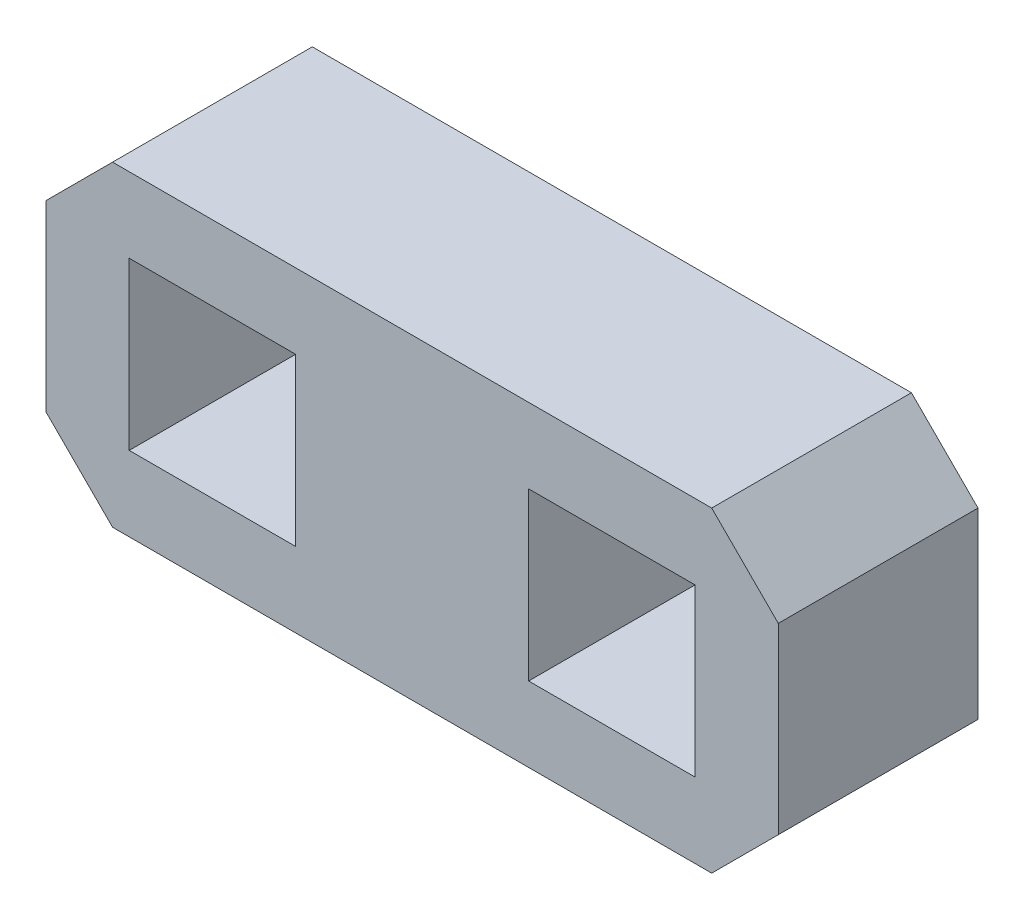
ISO-10303-21;
HEADER;
FILE_DESCRIPTION(('STEP AP214'),'2;1');
FILE_NAME('part.step','',(''),(''),'','','');
FILE_SCHEMA(('AUTOMOTIVE_DESIGN { 1 0 10303 214 1 1 1 1 }'));
ENDSEC;
DATA;
#1=APPLICATION_CONTEXT('core data for automotive mechanical design processes');
#2=APPLICATION_PROTOCOL_DEFINITION('international standard','automotive_design',2000,#1);
#3=PRODUCT_CONTEXT('',#1,'mechanical');
#4=PRODUCT('Part','Part','',(#3));
#5=PRODUCT_RELATED_PRODUCT_CATEGORY('part','',(#4));
#6=PRODUCT_DEFINITION_FORMATION('','',#4);
#7=PRODUCT_DEFINITION_CONTEXT('part definition',#1,'design');
#8=PRODUCT_DEFINITION('design','',#6,#7);
#9=PRODUCT_DEFINITION_SHAPE('','',#8);
#10=(LENGTH_UNIT() NAMED_UNIT(*) SI_UNIT(.MILLI.,.METRE.));
#11=(NAMED_UNIT(*) PLANE_ANGLE_UNIT() SI_UNIT($,.RADIAN.));
#12=(NAMED_UNIT(*) SI_UNIT($,.STERADIAN.) SOLID_ANGLE_UNIT());
#13=UNCERTAINTY_MEASURE_WITH_UNIT(LENGTH_MEASURE(1.E-05),#10,'distance_accuracy_value','');
#14=(GEOMETRIC_REPRESENTATION_CONTEXT(3) GLOBAL_UNCERTAINTY_ASSIGNED_CONTEXT((#13)) GLOBAL_UNIT_ASSIGNED_CONTEXT((#10,
#11,#12)) REPRESENTATION_CONTEXT('',''));
#15=CARTESIAN_POINT('',(0.,0.,0.));
#16=DIRECTION('',(0.,0.,1.));
#17=DIRECTION('',(1.,0.,0.));
#18=AXIS2_PLACEMENT_3D('',#15,#16,#17);
#19=CARTESIAN_POINT('',(0.,0.,3.));
#20=DIRECTION('',(0.,0.,-1.));
#21=DIRECTION('',(-1.,0.,0.));
#22=AXIS2_PLACEMENT_3D('',#19,#20,#21);
#23=PLANE('',#22);
#24=DIRECTION('',(0.,-1.,0.));
#25=VECTOR('',#24,1.);
#26=CARTESIAN_POINT('',(-11.,-4.75,3.));
#27=LINE('',#26,#25);
#28=CARTESIAN_POINT('',(-11.,2.75,3.));
#29=VERTEX_POINT('',#28);
#30=CARTESIAN_POINT('',(-11.,-2.74999999999999,3.));
#31=VERTEX_POINT('',#30);
#32=EDGE_CURVE('E269',#29,#31,#27,.T.);
#33=ORIENTED_EDGE('',*,*,#32,.T.);
#34=DIRECTION('',(-0.707106781186546,0.707106781186549,0.));
#35=VECTOR('',#34,1.);
#36=CARTESIAN_POINT('',(-8.99999999999999,-4.75,3.));
#37=LINE('',#36,#35);
#38=CARTESIAN_POINT('',(-8.99999999999999,-4.75,3.));
#39=VERTEX_POINT('',#38);
#40=EDGE_CURVE('E324',#31,#39,#37,.F.);
#41=ORIENTED_EDGE('',*,*,#40,.T.);
#42=DIRECTION('',(1.,0.,0.));
#43=VECTOR('',#42,1.);
#44=CARTESIAN_POINT('',(-11.,-4.75,3.));
#45=LINE('',#44,#43);
#46=CARTESIAN_POINT('',(8.99999999999999,-4.74999999999999,3.));
#47=VERTEX_POINT('',#46);
#48=EDGE_CURVE('E273',#39,#47,#45,.T.);
#49=ORIENTED_EDGE('',*,*,#48,.T.);
#50=DIRECTION('',(-0.70710678118655,-0.707106781186545,0.));
#51=VECTOR('',#50,1.);
#52=CARTESIAN_POINT('',(11.,-2.75,3.));
#53=LINE('',#52,#51);
#54=CARTESIAN_POINT('',(11.,-2.75,3.));
#55=VERTEX_POINT('',#54);
#56=EDGE_CURVE('E317',#47,#55,#53,.F.);
#57=ORIENTED_EDGE('',*,*,#56,.T.);
#58=DIRECTION('',(0.,1.,0.));
#59=VECTOR('',#58,1.);
#60=CARTESIAN_POINT('',(11.,-4.74999999999999,3.));
#61=LINE('',#60,#59);
#62=CARTESIAN_POINT('',(11.,2.74999999999999,3.));
#63=VERTEX_POINT('',#62);
#64=EDGE_CURVE('E263',#55,#63,#61,.T.);
#65=ORIENTED_EDGE('',*,*,#64,.T.);
#66=DIRECTION('',(0.707106781186546,-0.707106781186549,0.));
#67=VECTOR('',#66,1.);
#68=CARTESIAN_POINT('',(9.,4.75,3.));
#69=LINE('',#68,#67);
#70=CARTESIAN_POINT('',(9.,4.75,3.));
#71=VERTEX_POINT('',#70);
#72=EDGE_CURVE('E72',#63,#71,#69,.F.);
#73=ORIENTED_EDGE('',*,*,#72,.T.);
#74=DIRECTION('',(-1.,0.,0.));
#75=VECTOR('',#74,1.);
#76=CARTESIAN_POINT('',(-11.,4.75,3.));
#77=LINE('',#76,#75);
#78=CARTESIAN_POINT('',(-8.99999999999998,4.75,3.));
#79=VERTEX_POINT('',#78);
#80=EDGE_CURVE('E266',#71,#79,#77,.T.);
#81=ORIENTED_EDGE('',*,*,#80,.T.);
#82=DIRECTION('',(0.707106781186549,0.707106781186546,0.));
#83=VECTOR('',#82,1.);
#84=CARTESIAN_POINT('',(-11.,2.75,3.));
#85=LINE('',#84,#83);
#86=EDGE_CURVE('E325',#79,#29,#85,.F.);
#87=ORIENTED_EDGE('',*,*,#86,.T.);
#88=EDGE_LOOP('',(#33,#41,#49,#57,#65,#73,#81,#87));
#89=FACE_BOUND('',#88,.T.);
#90=DIRECTION('',(-1.,0.,0.));
#91=VECTOR('',#90,1.);
#92=CARTESIAN_POINT('',(3.50000000000001,2.5,3.));
#93=LINE('',#92,#91);
#94=CARTESIAN_POINT('',(8.50000000000001,2.5,3.));
#95=VERTEX_POINT('',#94);
#96=CARTESIAN_POINT('',(3.50000000000001,2.5,3.));
#97=VERTEX_POINT('',#96);
#98=EDGE_CURVE('E239',#95,#97,#93,.T.);
#99=ORIENTED_EDGE('',*,*,#98,.F.);
#100=DIRECTION('',(0.,1.,0.));
#101=VECTOR('',#100,1.);
#102=CARTESIAN_POINT('',(8.50000000000001,2.5,3.));
#103=LINE('',#102,#101);
#104=CARTESIAN_POINT('',(8.50000000000001,-2.5,3.));
#105=VERTEX_POINT('',#104);
#106=EDGE_CURVE('E213',#105,#95,#103,.T.);
#107=ORIENTED_EDGE('',*,*,#106,.F.);
#108=DIRECTION('',(1.,0.,0.));
#109=VECTOR('',#108,1.);
#110=CARTESIAN_POINT('',(3.50000000000001,-2.5,3.));
#111=LINE('',#110,#109);
#112=CARTESIAN_POINT('',(3.50000000000001,-2.5,3.));
#113=VERTEX_POINT('',#112);
#114=EDGE_CURVE('E221',#113,#105,#111,.T.);
#115=ORIENTED_EDGE('',*,*,#114,.F.);
#116=DIRECTION('',(0.,-1.,0.));
#117=VECTOR('',#116,1.);
#118=CARTESIAN_POINT('',(3.50000000000001,2.5,3.));
#119=LINE('',#118,#117);
#120=EDGE_CURVE('E245',#97,#113,#119,.T.);
#121=ORIENTED_EDGE('',*,*,#120,.F.);
#122=EDGE_LOOP('',(#99,#107,#115,#121));
#123=FACE_BOUND('',#122,.T.);
#124=DIRECTION('',(0.,1.,0.));
#125=VECTOR('',#124,1.);
#126=CARTESIAN_POINT('',(-8.50000000000001,2.5,3.));
#127=LINE('',#126,#125);
#128=CARTESIAN_POINT('',(-8.50000000000001,-2.5,3.));
#129=VERTEX_POINT('',#128);
#130=CARTESIAN_POINT('',(-8.50000000000001,2.5,3.));
#131=VERTEX_POINT('',#130);
#132=EDGE_CURVE('E184',#129,#131,#127,.T.);
#133=ORIENTED_EDGE('',*,*,#132,.T.);
#134=DIRECTION('',(1.,0.,0.));
#135=VECTOR('',#134,1.);
#136=CARTESIAN_POINT('',(-3.50000000000001,2.5,3.));
#137=LINE('',#136,#135);
#138=CARTESIAN_POINT('',(-3.50000000000001,2.5,3.));
#139=VERTEX_POINT('',#138);
#140=EDGE_CURVE('E191',#131,#139,#137,.T.);
#141=ORIENTED_EDGE('',*,*,#140,.T.);
#142=DIRECTION('',(0.,-1.,0.));
#143=VECTOR('',#142,1.);
#144=CARTESIAN_POINT('',(-3.50000000000001,2.5,3.));
#145=LINE('',#144,#143);
#146=CARTESIAN_POINT('',(-3.50000000000001,-2.5,3.));
#147=VERTEX_POINT('',#146);
#148=EDGE_CURVE('E194',#139,#147,#145,.T.);
#149=ORIENTED_EDGE('',*,*,#148,.T.);
#150=DIRECTION('',(-1.,0.,0.));
#151=VECTOR('',#150,1.);
#152=CARTESIAN_POINT('',(-3.50000000000001,-2.5,3.));
#153=LINE('',#152,#151);
#154=EDGE_CURVE('E204',#147,#129,#153,.T.);
#155=ORIENTED_EDGE('',*,*,#154,.T.);
#156=EDGE_LOOP('',(#133,#141,#149,#155));
#157=FACE_BOUND('',#156,.T.);
#158=ADVANCED_FACE('F50',(#89,#123,#157),#23,.F.);
#159=CARTESIAN_POINT('',(0.,0.,-3.));
#160=DIRECTION('',(0.,0.,-1.));
#161=DIRECTION('',(-1.,0.,0.));
#162=AXIS2_PLACEMENT_3D('',#159,#160,#161);
#163=PLANE('',#162);
#164=DIRECTION('',(0.,1.,0.));
#165=VECTOR('',#164,1.);
#166=CARTESIAN_POINT('',(8.50000000000001,2.5,-3.));
#167=LINE('',#166,#165);
#168=CARTESIAN_POINT('',(8.50000000000001,-2.5,-3.));
#169=VERTEX_POINT('',#168);
#170=CARTESIAN_POINT('',(8.50000000000001,2.5,-3.));
#171=VERTEX_POINT('',#170);
#172=EDGE_CURVE('E218',#169,#171,#167,.T.);
#173=ORIENTED_EDGE('',*,*,#172,.T.);
#174=DIRECTION('',(-1.,0.,0.));
#175=VECTOR('',#174,1.);
#176=CARTESIAN_POINT('',(3.50000000000001,2.5,-3.));
#177=LINE('',#176,#175);
#178=CARTESIAN_POINT('',(3.50000000000001,2.5,-3.));
#179=VERTEX_POINT('',#178);
#180=EDGE_CURVE('E224',#171,#179,#177,.T.);
#181=ORIENTED_EDGE('',*,*,#180,.T.);
#182=DIRECTION('',(0.,-1.,0.));
#183=VECTOR('',#182,1.);
#184=CARTESIAN_POINT('',(3.50000000000001,2.5,-3.));
#185=LINE('',#184,#183);
#186=CARTESIAN_POINT('',(3.50000000000001,-2.5,-3.));
#187=VERTEX_POINT('',#186);
#188=EDGE_CURVE('E230',#179,#187,#185,.T.);
#189=ORIENTED_EDGE('',*,*,#188,.T.);
#190=DIRECTION('',(1.,0.,0.));
#191=VECTOR('',#190,1.);
#192=CARTESIAN_POINT('',(3.50000000000001,-2.5,-3.));
#193=LINE('',#192,#191);
#194=EDGE_CURVE('E235',#187,#169,#193,.T.);
#195=ORIENTED_EDGE('',*,*,#194,.T.);
#196=EDGE_LOOP('',(#173,#181,#189,#195));
#197=FACE_BOUND('',#196,.T.);
#198=DIRECTION('',(1.,0.,0.));
#199=VECTOR('',#198,1.);
#200=CARTESIAN_POINT('',(-11.,-4.75,-3.));
#201=LINE('',#200,#199);
#202=CARTESIAN_POINT('',(-8.99999999999999,-4.75,-3.));
#203=VERTEX_POINT('',#202);
#204=CARTESIAN_POINT('',(8.99999999999999,-4.74999999999999,-3.));
#205=VERTEX_POINT('',#204);
#206=EDGE_CURVE('E270',#203,#205,#201,.T.);
#207=ORIENTED_EDGE('',*,*,#206,.F.);
#208=DIRECTION('',(0.707106781186546,-0.707106781186549,0.));
#209=VECTOR('',#208,1.);
#210=CARTESIAN_POINT('',(-6.87500000000001,-6.87499999999998,-3.));
#211=LINE('',#210,#209);
#212=CARTESIAN_POINT('',(-11.,-2.74999999999999,-3.));
#213=VERTEX_POINT('',#212);
#214=EDGE_CURVE('E307',#203,#213,#211,.F.);
#215=ORIENTED_EDGE('',*,*,#214,.T.);
#216=DIRECTION('',(0.,-1.,0.));
#217=VECTOR('',#216,1.);
#218=CARTESIAN_POINT('',(-11.,-4.75,-3.));
#219=LINE('',#218,#217);
#220=CARTESIAN_POINT('',(-11.,2.75,-3.));
#221=VERTEX_POINT('',#220);
#222=EDGE_CURVE('E282',#221,#213,#219,.T.);
#223=ORIENTED_EDGE('',*,*,#222,.F.);
#224=DIRECTION('',(-0.707106781186549,-0.707106781186546,0.));
#225=VECTOR('',#224,1.);
#226=CARTESIAN_POINT('',(-6.87499999999997,6.875,-3.));
#227=LINE('',#226,#225);
#228=CARTESIAN_POINT('',(-8.99999999999998,4.75,-3.));
#229=VERTEX_POINT('',#228);
#230=EDGE_CURVE('E303',#221,#229,#227,.F.);
#231=ORIENTED_EDGE('',*,*,#230,.T.);
#232=DIRECTION('',(-1.,0.,0.));
#233=VECTOR('',#232,1.);
#234=CARTESIAN_POINT('',(-11.,4.75,-3.));
#235=LINE('',#234,#233);
#236=CARTESIAN_POINT('',(9.,4.75,-3.));
#237=VERTEX_POINT('',#236);
#238=EDGE_CURVE('E281',#237,#229,#235,.T.);
#239=ORIENTED_EDGE('',*,*,#238,.F.);
#240=DIRECTION('',(-0.707106781186546,0.707106781186549,0.));
#241=VECTOR('',#240,1.);
#242=CARTESIAN_POINT('',(6.87500000000001,6.87499999999999,-3.));
#243=LINE('',#242,#241);
#244=CARTESIAN_POINT('',(11.,2.74999999999999,-3.));
#245=VERTEX_POINT('',#244);
#246=EDGE_CURVE('E300',#237,#245,#243,.F.);
#247=ORIENTED_EDGE('',*,*,#246,.T.);
#248=DIRECTION('',(0.,1.,0.));
#249=VECTOR('',#248,1.);
#250=CARTESIAN_POINT('',(11.,-4.74999999999999,-3.));
#251=LINE('',#250,#249);
#252=CARTESIAN_POINT('',(11.,-2.75,-3.));
#253=VERTEX_POINT('',#252);
#254=EDGE_CURVE('E251',#253,#245,#251,.T.);
#255=ORIENTED_EDGE('',*,*,#254,.F.);
#256=DIRECTION('',(0.70710678118655,0.707106781186545,0.));
#257=VECTOR('',#256,1.);
#258=CARTESIAN_POINT('',(6.87499999999996,-6.87500000000001,-3.));
#259=LINE('',#258,#257);
#260=EDGE_CURVE('E301',#253,#205,#259,.F.);
#261=ORIENTED_EDGE('',*,*,#260,.T.);
#262=EDGE_LOOP('',(#207,#215,#223,#231,#239,#247,#255,#261));
#263=FACE_BOUND('',#262,.T.);
#264=DIRECTION('',(1.,0.,0.));
#265=VECTOR('',#264,1.);
#266=CARTESIAN_POINT('',(-3.50000000000001,2.5,-3.));
#267=LINE('',#266,#265);
#268=CARTESIAN_POINT('',(-8.50000000000001,2.5,-3.));
#269=VERTEX_POINT('',#268);
#270=CARTESIAN_POINT('',(-3.50000000000001,2.5,-3.));
#271=VERTEX_POINT('',#270);
#272=EDGE_CURVE('E189',#269,#271,#267,.T.);
#273=ORIENTED_EDGE('',*,*,#272,.F.);
#274=DIRECTION('',(0.,1.,0.));
#275=VECTOR('',#274,1.);
#276=CARTESIAN_POINT('',(-8.50000000000001,2.5,-3.));
#277=LINE('',#276,#275);
#278=CARTESIAN_POINT('',(-8.50000000000001,-2.5,-3.));
#279=VERTEX_POINT('',#278);
#280=EDGE_CURVE('E180',#279,#269,#277,.T.);
#281=ORIENTED_EDGE('',*,*,#280,.F.);
#282=DIRECTION('',(-1.,0.,0.));
#283=VECTOR('',#282,1.);
#284=CARTESIAN_POINT('',(-3.50000000000001,-2.5,-3.));
#285=LINE('',#284,#283);
#286=CARTESIAN_POINT('',(-3.50000000000001,-2.5,-3.));
#287=VERTEX_POINT('',#286);
#288=EDGE_CURVE('E163',#287,#279,#285,.T.);
#289=ORIENTED_EDGE('',*,*,#288,.F.);
#290=DIRECTION('',(0.,-1.,0.));
#291=VECTOR('',#290,1.);
#292=CARTESIAN_POINT('',(-3.50000000000001,2.5,-3.));
#293=LINE('',#292,#291);
#294=EDGE_CURVE('E176',#271,#287,#293,.T.);
#295=ORIENTED_EDGE('',*,*,#294,.F.);
#296=EDGE_LOOP('',(#273,#281,#289,#295));
#297=FACE_BOUND('',#296,.T.);
#298=ADVANCED_FACE('F188',(#197,#263,#297),#163,.T.);
#299=CARTESIAN_POINT('',(11.,-4.74999999999999,3.));
#300=DIRECTION('',(-1.,0.,0.));
#301=DIRECTION('',(0.,-1.,0.));
#302=AXIS2_PLACEMENT_3D('',#299,#300,#301);
#303=PLANE('',#302);
#304=ORIENTED_EDGE('',*,*,#64,.F.);
#305=DIRECTION('',(0.,0.,-1.));
#306=VECTOR('',#305,1.);
#307=CARTESIAN_POINT('',(11.,-2.75,3.));
#308=LINE('',#307,#306);
#309=EDGE_CURVE('E11',#55,#253,#308,.T.);
#310=ORIENTED_EDGE('',*,*,#309,.T.);
#311=ORIENTED_EDGE('',*,*,#254,.T.);
#312=DIRECTION('',(0.,0.,1.));
#313=VECTOR('',#312,1.);
#314=CARTESIAN_POINT('',(11.,2.74999999999999,3.));
#315=LINE('',#314,#313);
#316=EDGE_CURVE('E60',#245,#63,#315,.T.);
#317=ORIENTED_EDGE('',*,*,#316,.T.);
#318=EDGE_LOOP('',(#304,#310,#311,#317));
#319=FACE_BOUND('',#318,.T.);
#320=ADVANCED_FACE('F336',(#319),#303,.F.);
#321=CARTESIAN_POINT('',(-11.,4.75,3.));
#322=DIRECTION('',(0.,-1.,0.));
#323=DIRECTION('',(1.,0.,0.));
#324=AXIS2_PLACEMENT_3D('',#321,#322,#323);
#325=PLANE('',#324);
#326=ORIENTED_EDGE('',*,*,#238,.T.);
#327=DIRECTION('',(0.,0.,1.));
#328=VECTOR('',#327,1.);
#329=CARTESIAN_POINT('',(-8.99999999999998,4.75,3.));
#330=LINE('',#329,#328);
#331=EDGE_CURVE('E63',#229,#79,#330,.T.);
#332=ORIENTED_EDGE('',*,*,#331,.T.);
#333=ORIENTED_EDGE('',*,*,#80,.F.);
#334=DIRECTION('',(0.,0.,-1.));
#335=VECTOR('',#334,1.);
#336=CARTESIAN_POINT('',(9.,4.75,3.));
#337=LINE('',#336,#335);
#338=EDGE_CURVE('E327',#71,#237,#337,.T.);
#339=ORIENTED_EDGE('',*,*,#338,.T.);
#340=EDGE_LOOP('',(#326,#332,#333,#339));
#341=FACE_BOUND('',#340,.T.);
#342=ADVANCED_FACE('F344',(#341),#325,.F.);
#343=CARTESIAN_POINT('',(-11.,-4.75,3.));
#344=DIRECTION('',(1.,0.,0.));
#345=DIRECTION('',(0.,0.,-1.));
#346=AXIS2_PLACEMENT_3D('',#343,#344,#345);
#347=PLANE('',#346);
#348=ORIENTED_EDGE('',*,*,#222,.T.);
#349=DIRECTION('',(0.,0.,1.));
#350=VECTOR('',#349,1.);
#351=CARTESIAN_POINT('',(-11.,-2.74999999999999,3.));
#352=LINE('',#351,#350);
#353=EDGE_CURVE('E314',#213,#31,#352,.T.);
#354=ORIENTED_EDGE('',*,*,#353,.T.);
#355=ORIENTED_EDGE('',*,*,#32,.F.);
#356=DIRECTION('',(0.,0.,-1.));
#357=VECTOR('',#356,1.);
#358=CARTESIAN_POINT('',(-11.,2.75,3.));
#359=LINE('',#358,#357);
#360=EDGE_CURVE('E309',#29,#221,#359,.T.);
#361=ORIENTED_EDGE('',*,*,#360,.T.);
#362=EDGE_LOOP('',(#348,#354,#355,#361));
#363=FACE_BOUND('',#362,.T.);
#364=ADVANCED_FACE('F352',(#363),#347,.F.);
#365=CARTESIAN_POINT('',(-11.,-4.75,3.));
#366=DIRECTION('',(0.,1.,0.));
#367=DIRECTION('',(-1.,0.,0.));
#368=AXIS2_PLACEMENT_3D('',#365,#366,#367);
#369=PLANE('',#368);
#370=ORIENTED_EDGE('',*,*,#48,.F.);
#371=DIRECTION('',(0.,0.,-1.));
#372=VECTOR('',#371,1.);
#373=CARTESIAN_POINT('',(-8.99999999999999,-4.75,3.));
#374=LINE('',#373,#372);
#375=EDGE_CURVE('E294',#39,#203,#374,.T.);
#376=ORIENTED_EDGE('',*,*,#375,.T.);
#377=ORIENTED_EDGE('',*,*,#206,.T.);
#378=DIRECTION('',(0.,0.,1.));
#379=VECTOR('',#378,1.);
#380=CARTESIAN_POINT('',(8.99999999999999,-4.74999999999999,3.));
#381=LINE('',#380,#379);
#382=EDGE_CURVE('E279',#205,#47,#381,.T.);
#383=ORIENTED_EDGE('',*,*,#382,.T.);
#384=EDGE_LOOP('',(#370,#376,#377,#383));
#385=FACE_BOUND('',#384,.T.);
#386=ADVANCED_FACE('F361',(#385),#369,.F.);
#387=CARTESIAN_POINT('',(8.50000000000001,2.5,-3.));
#388=DIRECTION('',(1.,0.,0.));
#389=DIRECTION('',(0.,1.,0.));
#390=AXIS2_PLACEMENT_3D('',#387,#388,#389);
#391=PLANE('',#390);
#392=ORIENTED_EDGE('',*,*,#106,.T.);
#393=DIRECTION('',(0.,0.,1.));
#394=VECTOR('',#393,1.);
#395=CARTESIAN_POINT('',(8.50000000000001,2.5,-3.));
#396=LINE('',#395,#394);
#397=EDGE_CURVE('E237',#171,#95,#396,.T.);
#398=ORIENTED_EDGE('',*,*,#397,.F.);
#399=ORIENTED_EDGE('',*,*,#172,.F.);
#400=DIRECTION('',(0.,0.,1.));
#401=VECTOR('',#400,1.);
#402=CARTESIAN_POINT('',(8.50000000000001,-2.5,-3.));
#403=LINE('',#402,#401);
#404=EDGE_CURVE('E249',#169,#105,#403,.T.);
#405=ORIENTED_EDGE('',*,*,#404,.T.);
#406=EDGE_LOOP('',(#392,#398,#399,#405));
#407=FACE_BOUND('',#406,.T.);
#408=ADVANCED_FACE('F382',(#407),#391,.F.);
#409=CARTESIAN_POINT('',(3.50000000000001,-2.5,-3.));
#410=DIRECTION('',(0.,-1.,0.));
#411=DIRECTION('',(1.,0.,0.));
#412=AXIS2_PLACEMENT_3D('',#409,#410,#411);
#413=PLANE('',#412);
#414=ORIENTED_EDGE('',*,*,#114,.T.);
#415=ORIENTED_EDGE('',*,*,#404,.F.);
#416=ORIENTED_EDGE('',*,*,#194,.F.);
#417=DIRECTION('',(0.,0.,1.));
#418=VECTOR('',#417,1.);
#419=CARTESIAN_POINT('',(3.50000000000001,-2.5,-3.));
#420=LINE('',#419,#418);
#421=EDGE_CURVE('E255',#187,#113,#420,.T.);
#422=ORIENTED_EDGE('',*,*,#421,.T.);
#423=EDGE_LOOP('',(#414,#415,#416,#422));
#424=FACE_BOUND('',#423,.T.);
#425=ADVANCED_FACE('F419',(#424),#413,.F.);
#426=CARTESIAN_POINT('',(3.50000000000001,2.5,-3.));
#427=DIRECTION('',(-1.,0.,0.));
#428=DIRECTION('',(0.,0.,1.));
#429=AXIS2_PLACEMENT_3D('',#426,#427,#428);
#430=PLANE('',#429);
#431=ORIENTED_EDGE('',*,*,#120,.T.);
#432=ORIENTED_EDGE('',*,*,#421,.F.);
#433=ORIENTED_EDGE('',*,*,#188,.F.);
#434=DIRECTION('',(0.,0.,1.));
#435=VECTOR('',#434,1.);
#436=CARTESIAN_POINT('',(3.50000000000001,2.5,-3.));
#437=LINE('',#436,#435);
#438=EDGE_CURVE('E260',#179,#97,#437,.T.);
#439=ORIENTED_EDGE('',*,*,#438,.T.);
#440=EDGE_LOOP('',(#431,#432,#433,#439));
#441=FACE_BOUND('',#440,.T.);
#442=ADVANCED_FACE('F421',(#441),#430,.F.);
#443=CARTESIAN_POINT('',(3.50000000000001,2.5,-3.));
#444=DIRECTION('',(0.,1.,0.));
#445=DIRECTION('',(-1.,0.,0.));
#446=AXIS2_PLACEMENT_3D('',#443,#444,#445);
#447=PLANE('',#446);
#448=ORIENTED_EDGE('',*,*,#98,.T.);
#449=ORIENTED_EDGE('',*,*,#438,.F.);
#450=ORIENTED_EDGE('',*,*,#180,.F.);
#451=ORIENTED_EDGE('',*,*,#397,.T.);
#452=EDGE_LOOP('',(#448,#449,#450,#451));
#453=FACE_BOUND('',#452,.T.);
#454=ADVANCED_FACE('F420',(#453),#447,.F.);
#455=CARTESIAN_POINT('',(-8.50000000000001,2.5,-3.));
#456=DIRECTION('',(1.,0.,0.));
#457=DIRECTION('',(0.,1.,0.));
#458=AXIS2_PLACEMENT_3D('',#455,#456,#457);
#459=PLANE('',#458);
#460=ORIENTED_EDGE('',*,*,#132,.F.);
#461=DIRECTION('',(0.,0.,1.));
#462=VECTOR('',#461,1.);
#463=CARTESIAN_POINT('',(-8.50000000000001,-2.5,-3.));
#464=LINE('',#463,#462);
#465=EDGE_CURVE('E169',#279,#129,#464,.T.);
#466=ORIENTED_EDGE('',*,*,#465,.F.);
#467=ORIENTED_EDGE('',*,*,#280,.T.);
#468=DIRECTION('',(0.,0.,1.));
#469=VECTOR('',#468,1.);
#470=CARTESIAN_POINT('',(-8.50000000000001,2.5,-3.));
#471=LINE('',#470,#469);
#472=EDGE_CURVE('E209',#269,#131,#471,.T.);
#473=ORIENTED_EDGE('',*,*,#472,.T.);
#474=EDGE_LOOP('',(#460,#466,#467,#473));
#475=FACE_BOUND('',#474,.T.);
#476=ADVANCED_FACE('F179',(#475),#459,.T.);
#477=CARTESIAN_POINT('',(-3.50000000000001,2.5,-3.));
#478=DIRECTION('',(0.,-1.,0.));
#479=DIRECTION('',(1.,0.,0.));
#480=AXIS2_PLACEMENT_3D('',#477,#478,#479);
#481=PLANE('',#480);
#482=ORIENTED_EDGE('',*,*,#140,.F.);
#483=ORIENTED_EDGE('',*,*,#472,.F.);
#484=ORIENTED_EDGE('',*,*,#272,.T.);
#485=DIRECTION('',(0.,0.,1.));
#486=VECTOR('',#485,1.);
#487=CARTESIAN_POINT('',(-3.50000000000001,2.5,-3.));
#488=LINE('',#487,#486);
#489=EDGE_CURVE('E212',#271,#139,#488,.T.);
#490=ORIENTED_EDGE('',*,*,#489,.T.);
#491=EDGE_LOOP('',(#482,#483,#484,#490));
#492=FACE_BOUND('',#491,.T.);
#493=ADVANCED_FACE('F415',(#492),#481,.T.);
#494=CARTESIAN_POINT('',(-3.50000000000001,2.5,-3.));
#495=DIRECTION('',(-1.,0.,0.));
#496=DIRECTION('',(0.,0.,1.));
#497=AXIS2_PLACEMENT_3D('',#494,#495,#496);
#498=PLANE('',#497);
#499=ORIENTED_EDGE('',*,*,#148,.F.);
#500=ORIENTED_EDGE('',*,*,#489,.F.);
#501=ORIENTED_EDGE('',*,*,#294,.T.);
#502=DIRECTION('',(0.,0.,1.));
#503=VECTOR('',#502,1.);
#504=CARTESIAN_POINT('',(-3.50000000000001,-2.5,-3.));
#505=LINE('',#504,#503);
#506=EDGE_CURVE('E168',#287,#147,#505,.T.);
#507=ORIENTED_EDGE('',*,*,#506,.T.);
#508=EDGE_LOOP('',(#499,#500,#501,#507));
#509=FACE_BOUND('',#508,.T.);
#510=ADVANCED_FACE('F406',(#509),#498,.T.);
#511=CARTESIAN_POINT('',(-3.50000000000001,-2.5,-3.));
#512=DIRECTION('',(0.,1.,0.));
#513=DIRECTION('',(-1.,0.,0.));
#514=AXIS2_PLACEMENT_3D('',#511,#512,#513);
#515=PLANE('',#514);
#516=ORIENTED_EDGE('',*,*,#154,.F.);
#517=ORIENTED_EDGE('',*,*,#506,.F.);
#518=ORIENTED_EDGE('',*,*,#288,.T.);
#519=ORIENTED_EDGE('',*,*,#465,.T.);
#520=EDGE_LOOP('',(#516,#517,#518,#519));
#521=FACE_BOUND('',#520,.T.);
#522=ADVANCED_FACE('F170',(#521),#515,.T.);
#523=CARTESIAN_POINT('',(-8.99999999999999,-4.75,3.));
#524=DIRECTION('',(0.707106781186549,0.707106781186546,0.));
#525=DIRECTION('',(0.,0.,-1.));
#526=AXIS2_PLACEMENT_3D('',#523,#524,#525);
#527=PLANE('',#526);
#528=ORIENTED_EDGE('',*,*,#40,.F.);
#529=ORIENTED_EDGE('',*,*,#353,.F.);
#530=ORIENTED_EDGE('',*,*,#214,.F.);
#531=ORIENTED_EDGE('',*,*,#375,.F.);
#532=EDGE_LOOP('',(#528,#529,#530,#531));
#533=FACE_BOUND('',#532,.T.);
#534=ADVANCED_FACE('F363',(#533),#527,.F.);
#535=CARTESIAN_POINT('',(-11.,2.75,3.));
#536=DIRECTION('',(0.707106781186546,-0.707106781186549,0.));
#537=DIRECTION('',(0.,0.,-1.));
#538=AXIS2_PLACEMENT_3D('',#535,#536,#537);
#539=PLANE('',#538);
#540=ORIENTED_EDGE('',*,*,#86,.F.);
#541=ORIENTED_EDGE('',*,*,#331,.F.);
#542=ORIENTED_EDGE('',*,*,#230,.F.);
#543=ORIENTED_EDGE('',*,*,#360,.F.);
#544=EDGE_LOOP('',(#540,#541,#542,#543));
#545=FACE_BOUND('',#544,.T.);
#546=ADVANCED_FACE('F351',(#545),#539,.F.);
#547=CARTESIAN_POINT('',(11.,-2.75,3.));
#548=DIRECTION('',(-0.707106781186545,0.70710678118655,0.));
#549=DIRECTION('',(0.,0.,-1.));
#550=AXIS2_PLACEMENT_3D('',#547,#548,#549);
#551=PLANE('',#550);
#552=ORIENTED_EDGE('',*,*,#56,.F.);
#553=ORIENTED_EDGE('',*,*,#382,.F.);
#554=ORIENTED_EDGE('',*,*,#260,.F.);
#555=ORIENTED_EDGE('',*,*,#309,.F.);
#556=EDGE_LOOP('',(#552,#553,#554,#555));
#557=FACE_BOUND('',#556,.T.);
#558=ADVANCED_FACE('F368',(#557),#551,.F.);
#559=CARTESIAN_POINT('',(9.,4.75,3.));
#560=DIRECTION('',(-0.707106781186549,-0.707106781186546,0.));
#561=DIRECTION('',(0.,0.,-1.));
#562=AXIS2_PLACEMENT_3D('',#559,#560,#561);
#563=PLANE('',#562);
#564=ORIENTED_EDGE('',*,*,#72,.F.);
#565=ORIENTED_EDGE('',*,*,#316,.F.);
#566=ORIENTED_EDGE('',*,*,#246,.F.);
#567=ORIENTED_EDGE('',*,*,#338,.F.);
#568=EDGE_LOOP('',(#564,#565,#566,#567));
#569=FACE_BOUND('',#568,.T.);
#570=ADVANCED_FACE('F49',(#569),#563,.F.);
#571=CLOSED_SHELL('',(#158,#298,#320,#342,#364,#386,#408,#425,#442,#454,#476,#493,#510,#522,
#534,#546,#558,#570));
#572=MANIFOLD_SOLID_BREP('B2',#571);
#573=ADVANCED_BREP_SHAPE_REPRESENTATION('',(#18,#572),#14);
#574=SHAPE_DEFINITION_REPRESENTATION(#9,#573);
ENDSEC;
END-ISO-10303-21;
